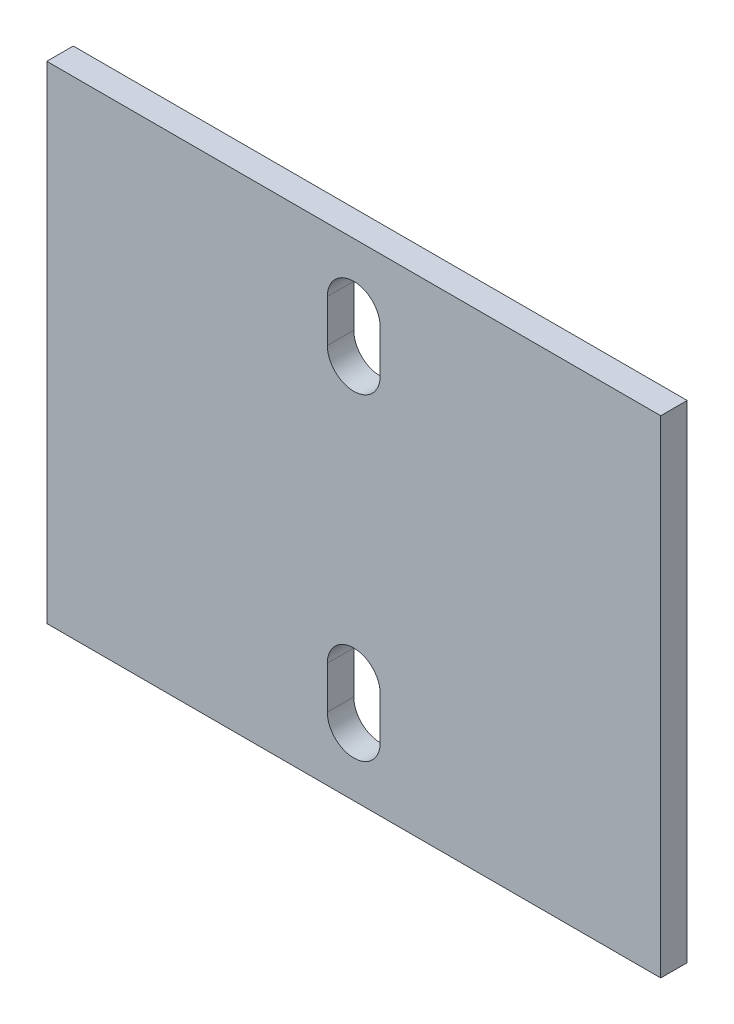
ISO-10303-21;
HEADER;
FILE_DESCRIPTION(('STEP AP214'),'2;1');
FILE_NAME('part.step','',(''),(''),'','','');
FILE_SCHEMA(('AUTOMOTIVE_DESIGN { 1 0 10303 214 1 1 1 1 }'));
ENDSEC;
DATA;
#1=APPLICATION_CONTEXT('core data for automotive mechanical design processes');
#2=APPLICATION_PROTOCOL_DEFINITION('international standard','automotive_design',2000,#1);
#3=PRODUCT_CONTEXT('',#1,'mechanical');
#4=PRODUCT('Part','Part','',(#3));
#5=PRODUCT_RELATED_PRODUCT_CATEGORY('part','',(#4));
#6=PRODUCT_DEFINITION_FORMATION('','',#4);
#7=PRODUCT_DEFINITION_CONTEXT('part definition',#1,'design');
#8=PRODUCT_DEFINITION('design','',#6,#7);
#9=PRODUCT_DEFINITION_SHAPE('','',#8);
#10=(LENGTH_UNIT() NAMED_UNIT(*) SI_UNIT(.MILLI.,.METRE.));
#11=(NAMED_UNIT(*) PLANE_ANGLE_UNIT() SI_UNIT($,.RADIAN.));
#12=(NAMED_UNIT(*) SI_UNIT($,.STERADIAN.) SOLID_ANGLE_UNIT());
#13=UNCERTAINTY_MEASURE_WITH_UNIT(LENGTH_MEASURE(1.E-05),#10,'distance_accuracy_value','');
#14=(GEOMETRIC_REPRESENTATION_CONTEXT(3) GLOBAL_UNCERTAINTY_ASSIGNED_CONTEXT((#13)) GLOBAL_UNIT_ASSIGNED_CONTEXT((#10,
#11,#12)) REPRESENTATION_CONTEXT('',''));
#15=CARTESIAN_POINT('',(0.,0.,0.));
#16=DIRECTION('',(0.,0.,1.));
#17=DIRECTION('',(1.,0.,0.));
#18=AXIS2_PLACEMENT_3D('',#15,#16,#17);
#19=CARTESIAN_POINT('',(0.,0.,1.25));
#20=DIRECTION('',(0.,0.,1.));
#21=DIRECTION('',(1.,0.,0.));
#22=AXIS2_PLACEMENT_3D('',#19,#20,#21);
#23=PLANE('',#22);
#24=DIRECTION('',(0.,1.,0.));
#25=VECTOR('',#24,1.);
#26=CARTESIAN_POINT('',(14.5,11.5,1.25));
#27=LINE('',#26,#25);
#28=CARTESIAN_POINT('',(14.5,-11.5,1.25));
#29=VERTEX_POINT('',#28);
#30=CARTESIAN_POINT('',(14.5,11.5,1.25));
#31=VERTEX_POINT('',#30);
#32=EDGE_CURVE('E220',#29,#31,#27,.T.);
#33=ORIENTED_EDGE('',*,*,#32,.T.);
#34=DIRECTION('',(-1.,0.,0.));
#35=VECTOR('',#34,1.);
#36=CARTESIAN_POINT('',(-14.5,11.5,1.25));
#37=LINE('',#36,#35);
#38=CARTESIAN_POINT('',(-14.5,11.5,1.25));
#39=VERTEX_POINT('',#38);
#40=EDGE_CURVE('E224',#31,#39,#37,.T.);
#41=ORIENTED_EDGE('',*,*,#40,.T.);
#42=DIRECTION('',(0.,-1.,0.));
#43=VECTOR('',#42,1.);
#44=CARTESIAN_POINT('',(-14.5,11.5,1.25));
#45=LINE('',#44,#43);
#46=CARTESIAN_POINT('',(-14.5,-11.5,1.25));
#47=VERTEX_POINT('',#46);
#48=EDGE_CURVE('E228',#39,#47,#45,.T.);
#49=ORIENTED_EDGE('',*,*,#48,.T.);
#50=DIRECTION('',(1.,0.,0.));
#51=VECTOR('',#50,1.);
#52=CARTESIAN_POINT('',(-14.5,-11.5,1.25));
#53=LINE('',#52,#51);
#54=EDGE_CURVE('E231',#47,#29,#53,.T.);
#55=ORIENTED_EDGE('',*,*,#54,.T.);
#56=EDGE_LOOP('',(#33,#41,#49,#55));
#57=FACE_BOUND('',#56,.T.);
#58=DIRECTION('',(0.,1.,0.));
#59=VECTOR('',#58,1.);
#60=CARTESIAN_POINT('',(1.25,6.5,1.25));
#61=LINE('',#60,#59);
#62=CARTESIAN_POINT('',(1.25,6.5,1.25));
#63=VERTEX_POINT('',#62);
#64=CARTESIAN_POINT('',(1.25,8.5,1.25));
#65=VERTEX_POINT('',#64);
#66=EDGE_CURVE('E180',#63,#65,#61,.T.);
#67=ORIENTED_EDGE('',*,*,#66,.F.);
#68=CARTESIAN_POINT('',(0.,6.5,1.25));
#69=DIRECTION('',(0.,0.,1.));
#70=DIRECTION('',(1.,0.,0.));
#71=AXIS2_PLACEMENT_3D('',#68,#69,#70);
#72=CIRCLE('',#71,1.25);
#73=CARTESIAN_POINT('',(-1.25,6.5,1.25));
#74=VERTEX_POINT('',#73);
#75=EDGE_CURVE('E177',#74,#63,#72,.T.);
#76=ORIENTED_EDGE('',*,*,#75,.F.);
#77=DIRECTION('',(0.,-1.,0.));
#78=VECTOR('',#77,1.);
#79=CARTESIAN_POINT('',(-1.25,6.5,1.25));
#80=LINE('',#79,#78);
#81=CARTESIAN_POINT('',(-1.25,8.5,1.25));
#82=VERTEX_POINT('',#81);
#83=EDGE_CURVE('E188',#82,#74,#80,.T.);
#84=ORIENTED_EDGE('',*,*,#83,.F.);
#85=CARTESIAN_POINT('',(0.,8.5,1.25));
#86=DIRECTION('',(0.,0.,1.));
#87=DIRECTION('',(1.,0.,0.));
#88=AXIS2_PLACEMENT_3D('',#85,#86,#87);
#89=CIRCLE('',#88,1.25);
#90=EDGE_CURVE('E184',#65,#82,#89,.T.);
#91=ORIENTED_EDGE('',*,*,#90,.F.);
#92=EDGE_LOOP('',(#67,#76,#84,#91));
#93=FACE_BOUND('',#92,.T.);
#94=DIRECTION('',(0.,-1.,0.));
#95=VECTOR('',#94,1.);
#96=CARTESIAN_POINT('',(-1.25,-6.5,1.25));
#97=LINE('',#96,#95);
#98=CARTESIAN_POINT('',(-1.25,-6.5,1.25));
#99=VERTEX_POINT('',#98);
#100=CARTESIAN_POINT('',(-1.25,-8.5,1.25));
#101=VERTEX_POINT('',#100);
#102=EDGE_CURVE('E138',#99,#101,#97,.T.);
#103=ORIENTED_EDGE('',*,*,#102,.F.);
#104=CARTESIAN_POINT('',(0.,-6.5,1.25));
#105=DIRECTION('',(0.,0.,1.));
#106=DIRECTION('',(1.,0.,0.));
#107=AXIS2_PLACEMENT_3D('',#104,#105,#106);
#108=CIRCLE('',#107,1.25);
#109=CARTESIAN_POINT('',(1.25,-6.5,1.25));
#110=VERTEX_POINT('',#109);
#111=EDGE_CURVE('E129',#110,#99,#108,.T.);
#112=ORIENTED_EDGE('',*,*,#111,.F.);
#113=DIRECTION('',(0.,1.,0.));
#114=VECTOR('',#113,1.);
#115=CARTESIAN_POINT('',(1.25,-6.5,1.25));
#116=LINE('',#115,#114);
#117=CARTESIAN_POINT('',(1.25,-8.5,1.25));
#118=VERTEX_POINT('',#117);
#119=EDGE_CURVE('E155',#118,#110,#116,.T.);
#120=ORIENTED_EDGE('',*,*,#119,.F.);
#121=CARTESIAN_POINT('',(0.,-8.5,1.25));
#122=DIRECTION('',(0.,0.,1.));
#123=DIRECTION('',(1.,0.,0.));
#124=AXIS2_PLACEMENT_3D('',#121,#122,#123);
#125=CIRCLE('',#124,1.25);
#126=EDGE_CURVE('E151',#101,#118,#125,.T.);
#127=ORIENTED_EDGE('',*,*,#126,.F.);
#128=EDGE_LOOP('',(#103,#112,#120,#127));
#129=FACE_BOUND('',#128,.T.);
#130=ADVANCED_FACE('F39',(#57,#93,#129),#23,.T.);
#131=CARTESIAN_POINT('',(0.,0.,0.));
#132=DIRECTION('',(0.,0.,1.));
#133=DIRECTION('',(1.,0.,0.));
#134=AXIS2_PLACEMENT_3D('',#131,#132,#133);
#135=PLANE('',#134);
#136=CARTESIAN_POINT('',(0.,6.5,0.));
#137=DIRECTION('',(0.,0.,1.));
#138=DIRECTION('',(1.,0.,0.));
#139=AXIS2_PLACEMENT_3D('',#136,#137,#138);
#140=CIRCLE('',#139,1.25);
#141=CARTESIAN_POINT('',(-1.25,6.5,0.));
#142=VERTEX_POINT('',#141);
#143=CARTESIAN_POINT('',(1.25,6.5,0.));
#144=VERTEX_POINT('',#143);
#145=EDGE_CURVE('E147',#142,#144,#140,.T.);
#146=ORIENTED_EDGE('',*,*,#145,.T.);
#147=DIRECTION('',(0.,1.,0.));
#148=VECTOR('',#147,1.);
#149=CARTESIAN_POINT('',(1.25,6.5,0.));
#150=LINE('',#149,#148);
#151=CARTESIAN_POINT('',(1.25,8.5,0.));
#152=VERTEX_POINT('',#151);
#153=EDGE_CURVE('E195',#144,#152,#150,.T.);
#154=ORIENTED_EDGE('',*,*,#153,.T.);
#155=CARTESIAN_POINT('',(0.,8.5,0.));
#156=DIRECTION('',(0.,0.,1.));
#157=DIRECTION('',(1.,0.,0.));
#158=AXIS2_PLACEMENT_3D('',#155,#156,#157);
#159=CIRCLE('',#158,1.25);
#160=CARTESIAN_POINT('',(-1.25,8.5,0.));
#161=VERTEX_POINT('',#160);
#162=EDGE_CURVE('E199',#152,#161,#159,.T.);
#163=ORIENTED_EDGE('',*,*,#162,.T.);
#164=DIRECTION('',(0.,-1.,0.));
#165=VECTOR('',#164,1.);
#166=CARTESIAN_POINT('',(-1.25,6.5,0.));
#167=LINE('',#166,#165);
#168=EDGE_CURVE('E181',#161,#142,#167,.T.);
#169=ORIENTED_EDGE('',*,*,#168,.T.);
#170=EDGE_LOOP('',(#146,#154,#163,#169));
#171=FACE_BOUND('',#170,.T.);
#172=DIRECTION('',(0.,1.,0.));
#173=VECTOR('',#172,1.);
#174=CARTESIAN_POINT('',(14.5,11.5,0.));
#175=LINE('',#174,#173);
#176=CARTESIAN_POINT('',(14.5,-11.5,0.));
#177=VERTEX_POINT('',#176);
#178=CARTESIAN_POINT('',(14.5,11.5,0.));
#179=VERTEX_POINT('',#178);
#180=EDGE_CURVE('E219',#177,#179,#175,.T.);
#181=ORIENTED_EDGE('',*,*,#180,.F.);
#182=DIRECTION('',(1.,0.,0.));
#183=VECTOR('',#182,1.);
#184=CARTESIAN_POINT('',(-14.5,-11.5,0.));
#185=LINE('',#184,#183);
#186=CARTESIAN_POINT('',(-14.5,-11.5,0.));
#187=VERTEX_POINT('',#186);
#188=EDGE_CURVE('E225',#187,#177,#185,.T.);
#189=ORIENTED_EDGE('',*,*,#188,.F.);
#190=DIRECTION('',(0.,-1.,0.));
#191=VECTOR('',#190,1.);
#192=CARTESIAN_POINT('',(-14.5,11.5,0.));
#193=LINE('',#192,#191);
#194=CARTESIAN_POINT('',(-14.5,11.5,0.));
#195=VERTEX_POINT('',#194);
#196=EDGE_CURVE('E241',#195,#187,#193,.T.);
#197=ORIENTED_EDGE('',*,*,#196,.F.);
#198=DIRECTION('',(-1.,0.,0.));
#199=VECTOR('',#198,1.);
#200=CARTESIAN_POINT('',(-14.5,11.5,0.));
#201=LINE('',#200,#199);
#202=EDGE_CURVE('E238',#179,#195,#201,.T.);
#203=ORIENTED_EDGE('',*,*,#202,.F.);
#204=EDGE_LOOP('',(#181,#189,#197,#203));
#205=FACE_BOUND('',#204,.T.);
#206=CARTESIAN_POINT('',(0.,-6.5,0.));
#207=DIRECTION('',(0.,0.,1.));
#208=DIRECTION('',(1.,0.,0.));
#209=AXIS2_PLACEMENT_3D('',#206,#207,#208);
#210=CIRCLE('',#209,1.25);
#211=CARTESIAN_POINT('',(1.25,-6.5,0.));
#212=VERTEX_POINT('',#211);
#213=CARTESIAN_POINT('',(-1.25,-6.5,0.));
#214=VERTEX_POINT('',#213);
#215=EDGE_CURVE('E63',#212,#214,#210,.T.);
#216=ORIENTED_EDGE('',*,*,#215,.T.);
#217=DIRECTION('',(0.,-1.,0.));
#218=VECTOR('',#217,1.);
#219=CARTESIAN_POINT('',(-1.25,-6.5,0.));
#220=LINE('',#219,#218);
#221=CARTESIAN_POINT('',(-1.25,-8.5,0.));
#222=VERTEX_POINT('',#221);
#223=EDGE_CURVE('E145',#214,#222,#220,.T.);
#224=ORIENTED_EDGE('',*,*,#223,.T.);
#225=CARTESIAN_POINT('',(0.,-8.5,0.));
#226=DIRECTION('',(0.,0.,1.));
#227=DIRECTION('',(1.,0.,0.));
#228=AXIS2_PLACEMENT_3D('',#225,#226,#227);
#229=CIRCLE('',#228,1.25);
#230=CARTESIAN_POINT('',(1.25,-8.5,0.));
#231=VERTEX_POINT('',#230);
#232=EDGE_CURVE('E164',#222,#231,#229,.T.);
#233=ORIENTED_EDGE('',*,*,#232,.T.);
#234=DIRECTION('',(0.,1.,0.));
#235=VECTOR('',#234,1.);
#236=CARTESIAN_POINT('',(1.25,-6.5,0.));
#237=LINE('',#236,#235);
#238=EDGE_CURVE('E139',#231,#212,#237,.T.);
#239=ORIENTED_EDGE('',*,*,#238,.T.);
#240=EDGE_LOOP('',(#216,#224,#233,#239));
#241=FACE_BOUND('',#240,.T.);
#242=ADVANCED_FACE('F264',(#171,#205,#241),#135,.F.);
#243=CARTESIAN_POINT('',(14.5,11.5,1.25));
#244=DIRECTION('',(-1.,0.,0.));
#245=DIRECTION('',(0.,0.,1.));
#246=AXIS2_PLACEMENT_3D('',#243,#244,#245);
#247=PLANE('',#246);
#248=ORIENTED_EDGE('',*,*,#180,.T.);
#249=DIRECTION('',(0.,0.,-1.));
#250=VECTOR('',#249,1.);
#251=CARTESIAN_POINT('',(14.5,11.5,1.25));
#252=LINE('',#251,#250);
#253=EDGE_CURVE('E11',#31,#179,#252,.T.);
#254=ORIENTED_EDGE('',*,*,#253,.F.);
#255=ORIENTED_EDGE('',*,*,#32,.F.);
#256=DIRECTION('',(0.,0.,-1.));
#257=VECTOR('',#256,1.);
#258=CARTESIAN_POINT('',(14.5,-11.5,1.25));
#259=LINE('',#258,#257);
#260=EDGE_CURVE('E234',#29,#177,#259,.T.);
#261=ORIENTED_EDGE('',*,*,#260,.T.);
#262=EDGE_LOOP('',(#248,#254,#255,#261));
#263=FACE_BOUND('',#262,.T.);
#264=ADVANCED_FACE('F41',(#263),#247,.F.);
#265=CARTESIAN_POINT('',(-14.5,11.5,1.25));
#266=DIRECTION('',(0.,-1.,0.));
#267=DIRECTION('',(0.,0.,-1.));
#268=AXIS2_PLACEMENT_3D('',#265,#266,#267);
#269=PLANE('',#268);
#270=ORIENTED_EDGE('',*,*,#202,.T.);
#271=DIRECTION('',(0.,0.,-1.));
#272=VECTOR('',#271,1.);
#273=CARTESIAN_POINT('',(-14.5,11.5,1.25));
#274=LINE('',#273,#272);
#275=EDGE_CURVE('E48',#39,#195,#274,.T.);
#276=ORIENTED_EDGE('',*,*,#275,.F.);
#277=ORIENTED_EDGE('',*,*,#40,.F.);
#278=ORIENTED_EDGE('',*,*,#253,.T.);
#279=EDGE_LOOP('',(#270,#276,#277,#278));
#280=FACE_BOUND('',#279,.T.);
#281=ADVANCED_FACE('F275',(#280),#269,.F.);
#282=CARTESIAN_POINT('',(-14.5,11.5,1.25));
#283=DIRECTION('',(1.,0.,0.));
#284=DIRECTION('',(0.,1.,0.));
#285=AXIS2_PLACEMENT_3D('',#282,#283,#284);
#286=PLANE('',#285);
#287=ORIENTED_EDGE('',*,*,#196,.T.);
#288=DIRECTION('',(0.,0.,-1.));
#289=VECTOR('',#288,1.);
#290=CARTESIAN_POINT('',(-14.5,-11.5,1.25));
#291=LINE('',#290,#289);
#292=EDGE_CURVE('E249',#47,#187,#291,.T.);
#293=ORIENTED_EDGE('',*,*,#292,.F.);
#294=ORIENTED_EDGE('',*,*,#48,.F.);
#295=ORIENTED_EDGE('',*,*,#275,.T.);
#296=EDGE_LOOP('',(#287,#293,#294,#295));
#297=FACE_BOUND('',#296,.T.);
#298=ADVANCED_FACE('F258',(#297),#286,.F.);
#299=CARTESIAN_POINT('',(-14.5,-11.5,1.25));
#300=DIRECTION('',(0.,1.,0.));
#301=DIRECTION('',(0.,0.,1.));
#302=AXIS2_PLACEMENT_3D('',#299,#300,#301);
#303=PLANE('',#302);
#304=ORIENTED_EDGE('',*,*,#188,.T.);
#305=ORIENTED_EDGE('',*,*,#260,.F.);
#306=ORIENTED_EDGE('',*,*,#54,.F.);
#307=ORIENTED_EDGE('',*,*,#292,.T.);
#308=EDGE_LOOP('',(#304,#305,#306,#307));
#309=FACE_BOUND('',#308,.T.);
#310=ADVANCED_FACE('F268',(#309),#303,.F.);
#311=CARTESIAN_POINT('',(0.,6.5,1.25));
#312=DIRECTION('',(0.,0.,-1.));
#313=DIRECTION('',(-1.,0.,0.));
#314=AXIS2_PLACEMENT_3D('',#311,#312,#313);
#315=CYLINDRICAL_SURFACE('',#314,1.25);
#316=ORIENTED_EDGE('',*,*,#145,.F.);
#317=DIRECTION('',(0.,0.,-1.));
#318=VECTOR('',#317,1.);
#319=CARTESIAN_POINT('',(-1.25,6.5,1.25));
#320=LINE('',#319,#318);
#321=EDGE_CURVE('E191',#74,#142,#320,.T.);
#322=ORIENTED_EDGE('',*,*,#321,.F.);
#323=ORIENTED_EDGE('',*,*,#75,.T.);
#324=DIRECTION('',(0.,0.,-1.));
#325=VECTOR('',#324,1.);
#326=CARTESIAN_POINT('',(1.25,6.5,1.25));
#327=LINE('',#326,#325);
#328=EDGE_CURVE('E215',#63,#144,#327,.T.);
#329=ORIENTED_EDGE('',*,*,#328,.T.);
#330=EDGE_LOOP('',(#316,#322,#323,#329));
#331=FACE_BOUND('',#330,.T.);
#332=ADVANCED_FACE('F290',(#331),#315,.F.);
#333=CARTESIAN_POINT('',(1.25,6.5,1.25));
#334=DIRECTION('',(-1.,0.,0.));
#335=DIRECTION('',(0.,-1.,0.));
#336=AXIS2_PLACEMENT_3D('',#333,#334,#335);
#337=PLANE('',#336);
#338=ORIENTED_EDGE('',*,*,#153,.F.);
#339=ORIENTED_EDGE('',*,*,#328,.F.);
#340=ORIENTED_EDGE('',*,*,#66,.T.);
#341=DIRECTION('',(0.,0.,-1.));
#342=VECTOR('',#341,1.);
#343=CARTESIAN_POINT('',(1.25,8.5,1.25));
#344=LINE('',#343,#342);
#345=EDGE_CURVE('E212',#65,#152,#344,.T.);
#346=ORIENTED_EDGE('',*,*,#345,.T.);
#347=EDGE_LOOP('',(#338,#339,#340,#346));
#348=FACE_BOUND('',#347,.T.);
#349=ADVANCED_FACE('F297',(#348),#337,.T.);
#350=CARTESIAN_POINT('',(0.,8.5,1.25));
#351=DIRECTION('',(0.,0.,-1.));
#352=DIRECTION('',(-1.,0.,0.));
#353=AXIS2_PLACEMENT_3D('',#350,#351,#352);
#354=CYLINDRICAL_SURFACE('',#353,1.25);
#355=ORIENTED_EDGE('',*,*,#162,.F.);
#356=ORIENTED_EDGE('',*,*,#345,.F.);
#357=ORIENTED_EDGE('',*,*,#90,.T.);
#358=DIRECTION('',(0.,0.,-1.));
#359=VECTOR('',#358,1.);
#360=CARTESIAN_POINT('',(-1.25,8.5,1.25));
#361=LINE('',#360,#359);
#362=EDGE_CURVE('E209',#82,#161,#361,.T.);
#363=ORIENTED_EDGE('',*,*,#362,.T.);
#364=EDGE_LOOP('',(#355,#356,#357,#363));
#365=FACE_BOUND('',#364,.T.);
#366=ADVANCED_FACE('F302',(#365),#354,.F.);
#367=CARTESIAN_POINT('',(-1.25,6.5,1.25));
#368=DIRECTION('',(1.,0.,0.));
#369=DIRECTION('',(0.,1.,0.));
#370=AXIS2_PLACEMENT_3D('',#367,#368,#369);
#371=PLANE('',#370);
#372=ORIENTED_EDGE('',*,*,#168,.F.);
#373=ORIENTED_EDGE('',*,*,#362,.F.);
#374=ORIENTED_EDGE('',*,*,#83,.T.);
#375=ORIENTED_EDGE('',*,*,#321,.T.);
#376=EDGE_LOOP('',(#372,#373,#374,#375));
#377=FACE_BOUND('',#376,.T.);
#378=ADVANCED_FACE('F309',(#377),#371,.T.);
#379=CARTESIAN_POINT('',(0.,-6.5,1.25));
#380=DIRECTION('',(0.,0.,-1.));
#381=DIRECTION('',(-1.,0.,0.));
#382=AXIS2_PLACEMENT_3D('',#379,#380,#381);
#383=CYLINDRICAL_SURFACE('',#382,1.25);
#384=ORIENTED_EDGE('',*,*,#215,.F.);
#385=DIRECTION('',(0.,0.,-1.));
#386=VECTOR('',#385,1.);
#387=CARTESIAN_POINT('',(1.25,-6.5,1.25));
#388=LINE('',#387,#386);
#389=EDGE_CURVE('E133',#110,#212,#388,.T.);
#390=ORIENTED_EDGE('',*,*,#389,.F.);
#391=ORIENTED_EDGE('',*,*,#111,.T.);
#392=DIRECTION('',(0.,0.,-1.));
#393=VECTOR('',#392,1.);
#394=CARTESIAN_POINT('',(-1.25,-6.5,1.25));
#395=LINE('',#394,#393);
#396=EDGE_CURVE('E132',#99,#214,#395,.T.);
#397=ORIENTED_EDGE('',*,*,#396,.T.);
#398=EDGE_LOOP('',(#384,#390,#391,#397));
#399=FACE_BOUND('',#398,.T.);
#400=ADVANCED_FACE('F131',(#399),#383,.F.);
#401=CARTESIAN_POINT('',(-1.25,-6.5,1.25));
#402=DIRECTION('',(1.,0.,0.));
#403=DIRECTION('',(0.,1.,0.));
#404=AXIS2_PLACEMENT_3D('',#401,#402,#403);
#405=PLANE('',#404);
#406=ORIENTED_EDGE('',*,*,#223,.F.);
#407=ORIENTED_EDGE('',*,*,#396,.F.);
#408=ORIENTED_EDGE('',*,*,#102,.T.);
#409=DIRECTION('',(0.,0.,-1.));
#410=VECTOR('',#409,1.);
#411=CARTESIAN_POINT('',(-1.25,-8.5,1.25));
#412=LINE('',#411,#410);
#413=EDGE_CURVE('E148',#101,#222,#412,.T.);
#414=ORIENTED_EDGE('',*,*,#413,.T.);
#415=EDGE_LOOP('',(#406,#407,#408,#414));
#416=FACE_BOUND('',#415,.T.);
#417=ADVANCED_FACE('F142',(#416),#405,.T.);
#418=CARTESIAN_POINT('',(0.,-8.5,1.25));
#419=DIRECTION('',(0.,0.,-1.));
#420=DIRECTION('',(-1.,0.,0.));
#421=AXIS2_PLACEMENT_3D('',#418,#419,#420);
#422=CYLINDRICAL_SURFACE('',#421,1.25);
#423=ORIENTED_EDGE('',*,*,#232,.F.);
#424=ORIENTED_EDGE('',*,*,#413,.F.);
#425=ORIENTED_EDGE('',*,*,#126,.T.);
#426=DIRECTION('',(0.,0.,-1.));
#427=VECTOR('',#426,1.);
#428=CARTESIAN_POINT('',(1.25,-8.5,1.25));
#429=LINE('',#428,#427);
#430=EDGE_CURVE('E55',#118,#231,#429,.T.);
#431=ORIENTED_EDGE('',*,*,#430,.T.);
#432=EDGE_LOOP('',(#423,#424,#425,#431));
#433=FACE_BOUND('',#432,.T.);
#434=ADVANCED_FACE('F327',(#433),#422,.F.);
#435=CARTESIAN_POINT('',(1.25,-6.5,1.25));
#436=DIRECTION('',(-1.,0.,0.));
#437=DIRECTION('',(0.,-1.,0.));
#438=AXIS2_PLACEMENT_3D('',#435,#436,#437);
#439=PLANE('',#438);
#440=ORIENTED_EDGE('',*,*,#238,.F.);
#441=ORIENTED_EDGE('',*,*,#430,.F.);
#442=ORIENTED_EDGE('',*,*,#119,.T.);
#443=ORIENTED_EDGE('',*,*,#389,.T.);
#444=EDGE_LOOP('',(#440,#441,#442,#443));
#445=FACE_BOUND('',#444,.T.);
#446=ADVANCED_FACE('F330',(#445),#439,.T.);
#447=CLOSED_SHELL('',(#130,#242,#264,#281,#298,#310,#332,#349,#366,#378,#400,#417,#434,#446));
#448=MANIFOLD_SOLID_BREP('B2',#447);
#449=ADVANCED_BREP_SHAPE_REPRESENTATION('',(#18,#448),#14);
#450=SHAPE_DEFINITION_REPRESENTATION(#9,#449);
ENDSEC;
END-ISO-10303-21;
